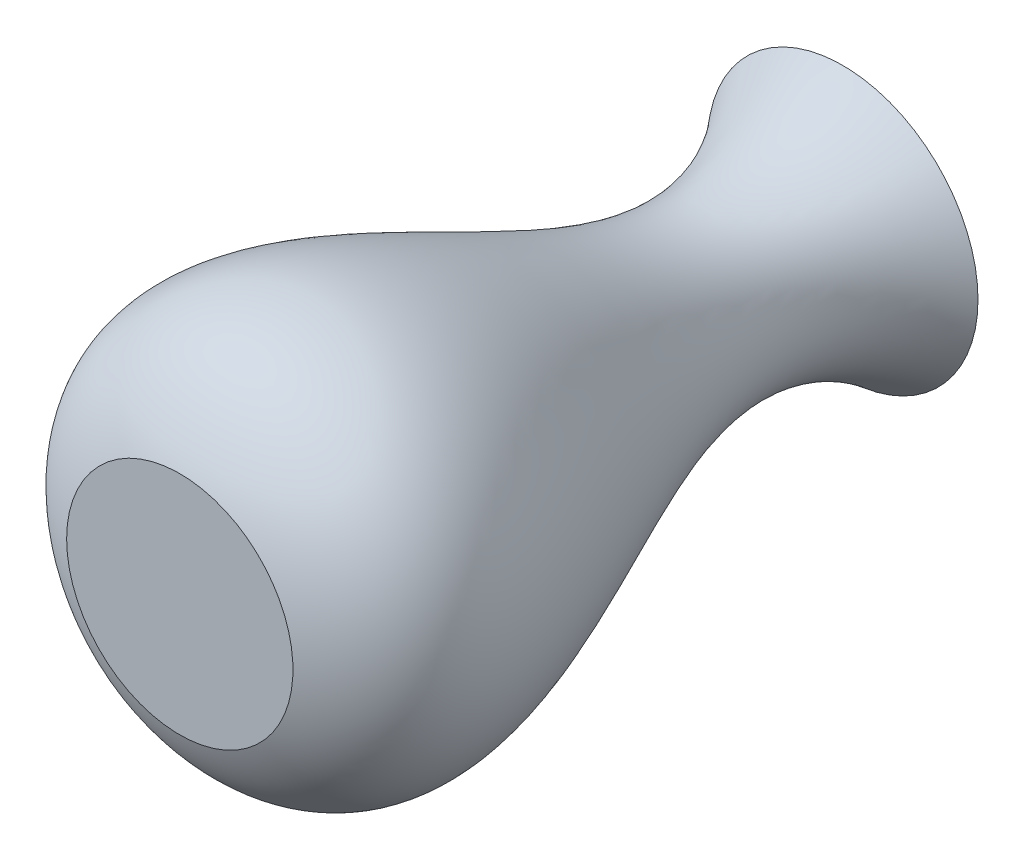
ISO-10303-21;
HEADER;
FILE_DESCRIPTION(('STEP AP214'),'2;1');
FILE_NAME('part.step','',(''),(''),'','','');
FILE_SCHEMA(('AUTOMOTIVE_DESIGN { 1 0 10303 214 1 1 1 1 }'));
ENDSEC;
DATA;
#1=APPLICATION_CONTEXT('core data for automotive mechanical design processes');
#2=APPLICATION_PROTOCOL_DEFINITION('international standard','automotive_design',2000,#1);
#3=PRODUCT_CONTEXT('',#1,'mechanical');
#4=PRODUCT('Part','Part','',(#3));
#5=PRODUCT_RELATED_PRODUCT_CATEGORY('part','',(#4));
#6=PRODUCT_DEFINITION_FORMATION('','',#4);
#7=PRODUCT_DEFINITION_CONTEXT('part definition',#1,'design');
#8=PRODUCT_DEFINITION('design','',#6,#7);
#9=PRODUCT_DEFINITION_SHAPE('','',#8);
#10=(LENGTH_UNIT() NAMED_UNIT(*) SI_UNIT(.MILLI.,.METRE.));
#11=(NAMED_UNIT(*) PLANE_ANGLE_UNIT() SI_UNIT($,.RADIAN.));
#12=(NAMED_UNIT(*) SI_UNIT($,.STERADIAN.) SOLID_ANGLE_UNIT());
#13=UNCERTAINTY_MEASURE_WITH_UNIT(LENGTH_MEASURE(1.E-05),#10,'distance_accuracy_value','');
#14=(GEOMETRIC_REPRESENTATION_CONTEXT(3) GLOBAL_UNCERTAINTY_ASSIGNED_CONTEXT((#13)) GLOBAL_UNIT_ASSIGNED_CONTEXT((#10,
#11,#12)) REPRESENTATION_CONTEXT('',''));
#15=CARTESIAN_POINT('',(0.,0.,0.));
#16=DIRECTION('',(0.,0.,1.));
#17=DIRECTION('',(1.,0.,0.));
#18=AXIS2_PLACEMENT_3D('',#15,#16,#17);
#19=CARTESIAN_POINT('',(-4.66898823525708,0.,-140.231321218783));
#20=CARTESIAN_POINT('',(14.9117394279062,0.,-116.992215229996));
#21=CARTESIAN_POINT('',(-4.30547173654196,0.,-72.7189995809841));
#22=CARTESIAN_POINT('',(-31.587344777387,0.,-12.7674377850608));
#23=CARTESIAN_POINT('',(0.,0.,0.));
#24=B_SPLINE_CURVE_WITH_KNOTS('',3,(#19,#20,#21,#22,#23),.UNSPECIFIED.,.F.,.F.,(4,1,4),(0.,
0.477594570797141,1.),.UNSPECIFIED.);
#25=CARTESIAN_POINT('',(23.9364475448063,0.,-140.231321218783));
#26=DIRECTION('',(0.,0.,-1.));
#27=AXIS1_PLACEMENT('',#25,#26);
#28=SURFACE_OF_REVOLUTION('',#24,#27);
#29=CARTESIAN_POINT('',(23.9364475448063,0.,0.));
#30=DIRECTION('',(0.,0.,-1.));
#31=DIRECTION('',(-1.,0.,0.));
#32=AXIS2_PLACEMENT_3D('',#29,#30,#31);
#33=CIRCLE('',#32,23.9364475448063);
#34=CARTESIAN_POINT('',(0.,0.,0.));
#35=VERTEX_POINT('',#34);
#36=EDGE_CURVE('E10',#35,#35,#33,.T.);
#37=ORIENTED_EDGE('',*,*,#36,.T.);
#38=EDGE_LOOP('',(#37));
#39=FACE_BOUND('',#38,.T.);
#40=CARTESIAN_POINT('',(23.9364475448063,0.,-140.231321218783));
#41=DIRECTION('',(0.,0.,-1.));
#42=DIRECTION('',(-1.,0.,0.));
#43=AXIS2_PLACEMENT_3D('',#40,#41,#42);
#44=CIRCLE('',#43,28.6054357800634);
#45=CARTESIAN_POINT('',(-4.66898823525708,0.,-140.231321218783));
#46=VERTEX_POINT('',#45);
#47=EDGE_CURVE('E46',#46,#46,#44,.T.);
#48=ORIENTED_EDGE('',*,*,#47,.F.);
#49=EDGE_LOOP('',(#48));
#50=FACE_BOUND('',#49,.T.);
#51=ADVANCED_FACE('F39',(#39,#50),#28,.F.);
#52=CARTESIAN_POINT('',(0.,0.,0.));
#53=DIRECTION('',(0.,0.,1.));
#54=DIRECTION('',(1.,0.,0.));
#55=AXIS2_PLACEMENT_3D('',#52,#53,#54);
#56=PLANE('',#55);
#57=ORIENTED_EDGE('',*,*,#36,.F.);
#58=EDGE_LOOP('',(#57));
#59=FACE_BOUND('',#58,.T.);
#60=ADVANCED_FACE('F41',(#59),#56,.T.);
#61=CARTESIAN_POINT('',(-4.66898823525708,0.,-140.231321218783));
#62=DIRECTION('',(0.,0.,-1.));
#63=DIRECTION('',(-1.,0.,0.));
#64=AXIS2_PLACEMENT_3D('',#61,#62,#63);
#65=PLANE('',#64);
#66=CARTESIAN_POINT('',(23.9364475448063,0.,-140.231321218783));
#67=DIRECTION('',(0.,0.,-1.));
#68=DIRECTION('',(-1.,0.,0.));
#69=AXIS2_PLACEMENT_3D('',#66,#67,#68);
#70=CIRCLE('',#69,28.273738458726);
#71=CARTESIAN_POINT('',(-4.33729091391969,0.,-140.231321218783));
#72=VERTEX_POINT('',#71);
#73=EDGE_CURVE('E54',#72,#72,#70,.T.);
#74=ORIENTED_EDGE('',*,*,#73,.F.);
#75=EDGE_LOOP('',(#74));
#76=FACE_BOUND('',#75,.T.);
#77=ORIENTED_EDGE('',*,*,#47,.T.);
#78=EDGE_LOOP('',(#77));
#79=FACE_BOUND('',#78,.T.);
#80=ADVANCED_FACE('F73',(#76,#79),#65,.T.);
#81=CARTESIAN_POINT('',(-4.66898823525708,0.,-140.231321218783));
#82=CARTESIAN_POINT('',(14.9117394279062,0.,-116.992215229996));
#83=CARTESIAN_POINT('',(-4.30547173654196,0.,-72.7189995809841));
#84=CARTESIAN_POINT('',(-31.587344777387,0.,-12.7674377850608));
#85=CARTESIAN_POINT('',(0.,0.,0.));
#86=B_SPLINE_CURVE_WITH_KNOTS('',3,(#81,#82,#83,#84,#85),.UNSPECIFIED.,.F.,.F.,(4,1,4),(0.,
0.477594570797141,1.),.UNSPECIFIED.);
#87=CARTESIAN_POINT('',(23.9364475448063,0.,-140.231321218783));
#88=DIRECTION('',(0.,0.,-1.));
#89=AXIS1_PLACEMENT('',#87,#88);
#90=SURFACE_OF_REVOLUTION('',#86,#89);
#91=OFFSET_SURFACE('',#90,0.254,.F.);
#92=CARTESIAN_POINT('',(23.9364475448063,0.,-0.254000000000004));
#93=DIRECTION('',(0.,0.,-1.));
#94=DIRECTION('',(-1.,0.,0.));
#95=AXIS2_PLACEMENT_3D('',#92,#93,#94);
#96=CIRCLE('',#95,23.886991368795);
#97=CARTESIAN_POINT('',(0.0494561760112991,0.,-0.254000000000004));
#98=VERTEX_POINT('',#97);
#99=EDGE_CURVE('E50',#98,#98,#96,.T.);
#100=ORIENTED_EDGE('',*,*,#99,.F.);
#101=EDGE_LOOP('',(#100));
#102=FACE_BOUND('',#101,.T.);
#103=ORIENTED_EDGE('',*,*,#73,.T.);
#104=EDGE_LOOP('',(#103));
#105=FACE_BOUND('',#104,.T.);
#106=ADVANCED_FACE('F69',(#102,#105),#91,.T.);
#107=CARTESIAN_POINT('',(0.,0.,-0.254));
#108=DIRECTION('',(0.,0.,1.));
#109=DIRECTION('',(1.,0.,0.));
#110=AXIS2_PLACEMENT_3D('',#107,#108,#109);
#111=PLANE('',#110);
#112=ORIENTED_EDGE('',*,*,#99,.T.);
#113=EDGE_LOOP('',(#112));
#114=FACE_BOUND('',#113,.T.);
#115=ADVANCED_FACE('F70',(#114),#111,.F.);
#116=CLOSED_SHELL('',(#51,#60,#80,#106,#115));
#117=MANIFOLD_SOLID_BREP('B2',#116);
#118=ADVANCED_BREP_SHAPE_REPRESENTATION('',(#18,#117),#14);
#119=SHAPE_DEFINITION_REPRESENTATION(#9,#118);
ENDSEC;
END-ISO-10303-21;
